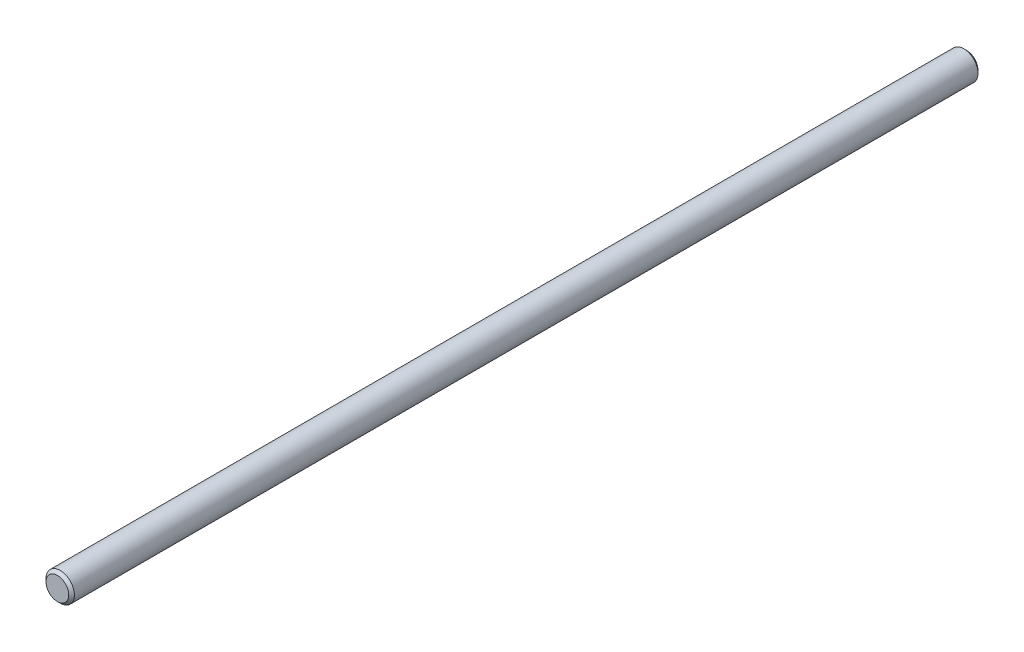
ISO-10303-21;
HEADER;
FILE_DESCRIPTION(('STEP AP214'),'2;1');
FILE_NAME('part.step','',(''),(''),'','','');
FILE_SCHEMA(('AUTOMOTIVE_DESIGN { 1 0 10303 214 1 1 1 1 }'));
ENDSEC;
DATA;
#1=APPLICATION_CONTEXT('core data for automotive mechanical design processes');
#2=APPLICATION_PROTOCOL_DEFINITION('international standard','automotive_design',2000,#1);
#3=PRODUCT_CONTEXT('',#1,'mechanical');
#4=PRODUCT('Part','Part','',(#3));
#5=PRODUCT_RELATED_PRODUCT_CATEGORY('part','',(#4));
#6=PRODUCT_DEFINITION_FORMATION('','',#4);
#7=PRODUCT_DEFINITION_CONTEXT('part definition',#1,'design');
#8=PRODUCT_DEFINITION('design','',#6,#7);
#9=PRODUCT_DEFINITION_SHAPE('','',#8);
#10=(LENGTH_UNIT() NAMED_UNIT(*) SI_UNIT(.MILLI.,.METRE.));
#11=(NAMED_UNIT(*) PLANE_ANGLE_UNIT() SI_UNIT($,.RADIAN.));
#12=(NAMED_UNIT(*) SI_UNIT($,.STERADIAN.) SOLID_ANGLE_UNIT());
#13=UNCERTAINTY_MEASURE_WITH_UNIT(LENGTH_MEASURE(1.E-05),#10,'distance_accuracy_value','');
#14=(GEOMETRIC_REPRESENTATION_CONTEXT(3) GLOBAL_UNCERTAINTY_ASSIGNED_CONTEXT((#13)) GLOBAL_UNIT_ASSIGNED_CONTEXT((#10,
#11,#12)) REPRESENTATION_CONTEXT('',''));
#15=CARTESIAN_POINT('',(0.,0.,0.));
#16=DIRECTION('',(0.,0.,1.));
#17=DIRECTION('',(1.,0.,0.));
#18=AXIS2_PLACEMENT_3D('',#15,#16,#17);
#19=CARTESIAN_POINT('',(0.,0.,0.5));
#20=DIRECTION('',(0.,0.,1.));
#21=DIRECTION('',(-1.,0.,0.));
#22=AXIS2_PLACEMENT_3D('',#19,#20,#21);
#23=CONICAL_SURFACE('',#22,4.5,0.785398163397448);
#24=CARTESIAN_POINT('',(0.,0.,1.));
#25=DIRECTION('',(0.,0.,-1.));
#26=DIRECTION('',(-1.,0.,0.));
#27=AXIS2_PLACEMENT_3D('',#24,#25,#26);
#28=CIRCLE('',#27,5.);
#29=CARTESIAN_POINT('',(5.,0.,1.));
#30=VERTEX_POINT('',#29);
#31=EDGE_CURVE('E11',#30,#30,#28,.T.);
#32=ORIENTED_EDGE('',*,*,#31,.T.);
#33=EDGE_LOOP('',(#32));
#34=FACE_BOUND('',#33,.T.);
#35=CARTESIAN_POINT('',(0.,0.,0.));
#36=DIRECTION('',(0.,0.,1.));
#37=DIRECTION('',(-1.,0.,0.));
#38=AXIS2_PLACEMENT_3D('',#35,#36,#37);
#39=CIRCLE('',#38,4.);
#40=CARTESIAN_POINT('',(4.,0.,0.));
#41=VERTEX_POINT('',#40);
#42=EDGE_CURVE('E27',#41,#41,#39,.T.);
#43=ORIENTED_EDGE('',*,*,#42,.T.);
#44=EDGE_LOOP('',(#43));
#45=FACE_BOUND('',#44,.T.);
#46=ADVANCED_FACE('F17',(#34,#45),#23,.T.);
#47=CARTESIAN_POINT('',(0.,0.,0.));
#48=DIRECTION('',(0.,0.,1.));
#49=DIRECTION('',(-1.,0.,0.));
#50=AXIS2_PLACEMENT_3D('',#47,#48,#49);
#51=CYLINDRICAL_SURFACE('',#50,5.);
#52=CARTESIAN_POINT('',(0.,0.,319.));
#53=DIRECTION('',(0.,0.,1.));
#54=DIRECTION('',(-1.,0.,0.));
#55=AXIS2_PLACEMENT_3D('',#52,#53,#54);
#56=CIRCLE('',#55,5.);
#57=CARTESIAN_POINT('',(5.,0.,319.));
#58=VERTEX_POINT('',#57);
#59=EDGE_CURVE('E39',#58,#58,#56,.T.);
#60=ORIENTED_EDGE('',*,*,#59,.F.);
#61=EDGE_LOOP('',(#60));
#62=FACE_BOUND('',#61,.T.);
#63=ORIENTED_EDGE('',*,*,#31,.F.);
#64=EDGE_LOOP('',(#63));
#65=FACE_BOUND('',#64,.T.);
#66=ADVANCED_FACE('F52',(#62,#65),#51,.T.);
#67=CARTESIAN_POINT('',(0.,0.,0.));
#68=DIRECTION('',(0.,0.,1.));
#69=DIRECTION('',(0.707106781186548,0.707106781186548,0.));
#70=AXIS2_PLACEMENT_3D('',#67,#68,#69);
#71=PLANE('',#70);
#72=ORIENTED_EDGE('',*,*,#42,.F.);
#73=EDGE_LOOP('',(#72));
#74=FACE_BOUND('',#73,.T.);
#75=ADVANCED_FACE('F49',(#74),#71,.F.);
#76=CARTESIAN_POINT('',(0.,0.,319.5));
#77=DIRECTION('',(0.,0.,-1.));
#78=DIRECTION('',(-1.,0.,0.));
#79=AXIS2_PLACEMENT_3D('',#76,#77,#78);
#80=CONICAL_SURFACE('',#79,4.5,0.785398163397441);
#81=ORIENTED_EDGE('',*,*,#59,.T.);
#82=EDGE_LOOP('',(#81));
#83=FACE_BOUND('',#82,.T.);
#84=CARTESIAN_POINT('',(0.,0.,320.));
#85=DIRECTION('',(0.,0.,-1.));
#86=DIRECTION('',(-1.,0.,0.));
#87=AXIS2_PLACEMENT_3D('',#84,#85,#86);
#88=CIRCLE('',#87,4.);
#89=CARTESIAN_POINT('',(4.,0.,320.));
#90=VERTEX_POINT('',#89);
#91=EDGE_CURVE('E21',#90,#90,#88,.T.);
#92=ORIENTED_EDGE('',*,*,#91,.T.);
#93=EDGE_LOOP('',(#92));
#94=FACE_BOUND('',#93,.T.);
#95=ADVANCED_FACE('F51',(#83,#94),#80,.T.);
#96=CARTESIAN_POINT('',(0.,0.,320.));
#97=DIRECTION('',(0.,0.,1.));
#98=DIRECTION('',(0.707106781186548,0.707106781186548,0.));
#99=AXIS2_PLACEMENT_3D('',#96,#97,#98);
#100=PLANE('',#99);
#101=ORIENTED_EDGE('',*,*,#91,.F.);
#102=EDGE_LOOP('',(#101));
#103=FACE_BOUND('',#102,.T.);
#104=ADVANCED_FACE('F19',(#103),#100,.T.);
#105=CLOSED_SHELL('',(#46,#66,#75,#95,#104));
#106=MANIFOLD_SOLID_BREP('B1',#105);
#107=ADVANCED_BREP_SHAPE_REPRESENTATION('',(#18,#106),#14);
#108=SHAPE_DEFINITION_REPRESENTATION(#9,#107);
ENDSEC;
END-ISO-10303-21;
